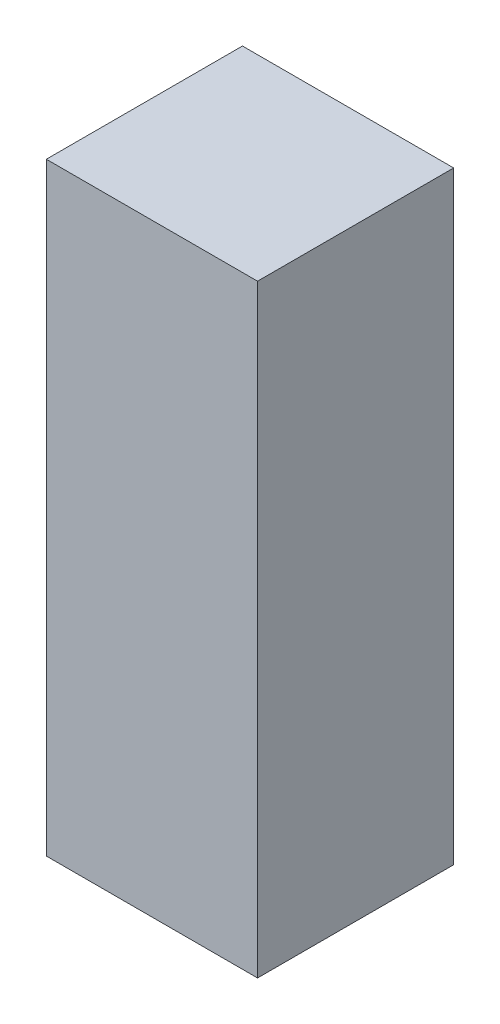
ISO-10303-21;
HEADER;
FILE_DESCRIPTION(('STEP AP214'),'2;1');
FILE_NAME('part.step','',(''),(''),'','','');
FILE_SCHEMA(('AUTOMOTIVE_DESIGN { 1 0 10303 214 1 1 1 1 }'));
ENDSEC;
DATA;
#1=APPLICATION_CONTEXT('core data for automotive mechanical design processes');
#2=APPLICATION_PROTOCOL_DEFINITION('international standard','automotive_design',2000,#1);
#3=PRODUCT_CONTEXT('',#1,'mechanical');
#4=PRODUCT('Part','Part','',(#3));
#5=PRODUCT_RELATED_PRODUCT_CATEGORY('part','',(#4));
#6=PRODUCT_DEFINITION_FORMATION('','',#4);
#7=PRODUCT_DEFINITION_CONTEXT('part definition',#1,'design');
#8=PRODUCT_DEFINITION('design','',#6,#7);
#9=PRODUCT_DEFINITION_SHAPE('','',#8);
#10=(LENGTH_UNIT() NAMED_UNIT(*) SI_UNIT(.MILLI.,.METRE.));
#11=(NAMED_UNIT(*) PLANE_ANGLE_UNIT() SI_UNIT($,.RADIAN.));
#12=(NAMED_UNIT(*) SI_UNIT($,.STERADIAN.) SOLID_ANGLE_UNIT());
#13=UNCERTAINTY_MEASURE_WITH_UNIT(LENGTH_MEASURE(1.E-05),#10,'distance_accuracy_value','');
#14=(GEOMETRIC_REPRESENTATION_CONTEXT(3) GLOBAL_UNCERTAINTY_ASSIGNED_CONTEXT((#13)) GLOBAL_UNIT_ASSIGNED_CONTEXT((#10,
#11,#12)) REPRESENTATION_CONTEXT('',''));
#15=CARTESIAN_POINT('',(0.,0.,0.));
#16=DIRECTION('',(0.,0.,1.));
#17=DIRECTION('',(1.,0.,0.));
#18=AXIS2_PLACEMENT_3D('',#15,#16,#17);
#19=CARTESIAN_POINT('',(24.,1040.,33.));
#20=DIRECTION('',(1.,0.,0.));
#21=DIRECTION('',(0.,0.,-1.));
#22=AXIS2_PLACEMENT_3D('',#19,#20,#21);
#23=PLANE('',#22);
#24=DIRECTION('',(0.,-1.,0.));
#25=VECTOR('',#24,1.);
#26=CARTESIAN_POINT('',(24.,1040.,20.));
#27=LINE('',#26,#25);
#28=CARTESIAN_POINT('',(24.,1080.,20.));
#29=VERTEX_POINT('',#28);
#30=CARTESIAN_POINT('',(24.,1040.,20.));
#31=VERTEX_POINT('',#30);
#32=EDGE_CURVE('E102',#29,#31,#27,.T.);
#33=ORIENTED_EDGE('',*,*,#32,.T.);
#34=DIRECTION('',(0.,0.,-1.));
#35=VECTOR('',#34,1.);
#36=CARTESIAN_POINT('',(24.,1040.,33.));
#37=LINE('',#36,#35);
#38=CARTESIAN_POINT('',(24.,1040.,33.));
#39=VERTEX_POINT('',#38);
#40=EDGE_CURVE('E11',#39,#31,#37,.T.);
#41=ORIENTED_EDGE('',*,*,#40,.F.);
#42=DIRECTION('',(0.,-1.,0.));
#43=VECTOR('',#42,1.);
#44=CARTESIAN_POINT('',(24.,1040.,33.));
#45=LINE('',#44,#43);
#46=CARTESIAN_POINT('',(24.,1080.,33.));
#47=VERTEX_POINT('',#46);
#48=EDGE_CURVE('E90',#47,#39,#45,.T.);
#49=ORIENTED_EDGE('',*,*,#48,.F.);
#50=DIRECTION('',(0.,0.,-1.));
#51=VECTOR('',#50,1.);
#52=CARTESIAN_POINT('',(24.,1080.,33.));
#53=LINE('',#52,#51);
#54=EDGE_CURVE('E98',#47,#29,#53,.T.);
#55=ORIENTED_EDGE('',*,*,#54,.T.);
#56=EDGE_LOOP('',(#33,#41,#49,#55));
#57=FACE_BOUND('',#56,.T.);
#58=ADVANCED_FACE('F39',(#57),#23,.F.);
#59=CARTESIAN_POINT('',(24.,1040.,33.));
#60=DIRECTION('',(0.,1.,0.));
#61=DIRECTION('',(0.,0.,1.));
#62=AXIS2_PLACEMENT_3D('',#59,#60,#61);
#63=PLANE('',#62);
#64=DIRECTION('',(1.,0.,0.));
#65=VECTOR('',#64,1.);
#66=CARTESIAN_POINT('',(24.,1040.,20.));
#67=LINE('',#66,#65);
#68=CARTESIAN_POINT('',(38.,1040.,20.));
#69=VERTEX_POINT('',#68);
#70=EDGE_CURVE('E94',#31,#69,#67,.T.);
#71=ORIENTED_EDGE('',*,*,#70,.T.);
#72=DIRECTION('',(0.,0.,-1.));
#73=VECTOR('',#72,1.);
#74=CARTESIAN_POINT('',(38.,1040.,33.));
#75=LINE('',#74,#73);
#76=CARTESIAN_POINT('',(38.,1040.,33.));
#77=VERTEX_POINT('',#76);
#78=EDGE_CURVE('E47',#77,#69,#75,.T.);
#79=ORIENTED_EDGE('',*,*,#78,.F.);
#80=DIRECTION('',(1.,0.,0.));
#81=VECTOR('',#80,1.);
#82=CARTESIAN_POINT('',(24.,1040.,33.));
#83=LINE('',#82,#81);
#84=EDGE_CURVE('E85',#39,#77,#83,.T.);
#85=ORIENTED_EDGE('',*,*,#84,.F.);
#86=ORIENTED_EDGE('',*,*,#40,.T.);
#87=EDGE_LOOP('',(#71,#79,#85,#86));
#88=FACE_BOUND('',#87,.T.);
#89=ADVANCED_FACE('F93',(#88),#63,.F.);
#90=CARTESIAN_POINT('',(38.,1040.,33.));
#91=DIRECTION('',(-1.,0.,0.));
#92=DIRECTION('',(0.,0.,1.));
#93=AXIS2_PLACEMENT_3D('',#90,#91,#92);
#94=PLANE('',#93);
#95=DIRECTION('',(0.,1.,0.));
#96=VECTOR('',#95,1.);
#97=CARTESIAN_POINT('',(38.,1040.,20.));
#98=LINE('',#97,#96);
#99=CARTESIAN_POINT('',(38.,1080.,20.));
#100=VERTEX_POINT('',#99);
#101=EDGE_CURVE('E72',#69,#100,#98,.T.);
#102=ORIENTED_EDGE('',*,*,#101,.T.);
#103=DIRECTION('',(0.,0.,-1.));
#104=VECTOR('',#103,1.);
#105=CARTESIAN_POINT('',(38.,1080.,33.));
#106=LINE('',#105,#104);
#107=CARTESIAN_POINT('',(38.,1080.,33.));
#108=VERTEX_POINT('',#107);
#109=EDGE_CURVE('E95',#108,#100,#106,.T.);
#110=ORIENTED_EDGE('',*,*,#109,.F.);
#111=DIRECTION('',(0.,1.,0.));
#112=VECTOR('',#111,1.);
#113=CARTESIAN_POINT('',(38.,1040.,33.));
#114=LINE('',#113,#112);
#115=EDGE_CURVE('E88',#77,#108,#114,.T.);
#116=ORIENTED_EDGE('',*,*,#115,.F.);
#117=ORIENTED_EDGE('',*,*,#78,.T.);
#118=EDGE_LOOP('',(#102,#110,#116,#117));
#119=FACE_BOUND('',#118,.T.);
#120=ADVANCED_FACE('F96',(#119),#94,.F.);
#121=CARTESIAN_POINT('',(24.,1080.,33.));
#122=DIRECTION('',(0.,-1.,0.));
#123=DIRECTION('',(0.,0.,-1.));
#124=AXIS2_PLACEMENT_3D('',#121,#122,#123);
#125=PLANE('',#124);
#126=DIRECTION('',(-1.,0.,0.));
#127=VECTOR('',#126,1.);
#128=CARTESIAN_POINT('',(24.,1080.,20.));
#129=LINE('',#128,#127);
#130=EDGE_CURVE('E78',#100,#29,#129,.T.);
#131=ORIENTED_EDGE('',*,*,#130,.T.);
#132=ORIENTED_EDGE('',*,*,#54,.F.);
#133=DIRECTION('',(-1.,0.,0.));
#134=VECTOR('',#133,1.);
#135=CARTESIAN_POINT('',(24.,1080.,33.));
#136=LINE('',#135,#134);
#137=EDGE_CURVE('E55',#108,#47,#136,.T.);
#138=ORIENTED_EDGE('',*,*,#137,.F.);
#139=ORIENTED_EDGE('',*,*,#109,.T.);
#140=EDGE_LOOP('',(#131,#132,#138,#139));
#141=FACE_BOUND('',#140,.T.);
#142=ADVANCED_FACE('F109',(#141),#125,.F.);
#143=CARTESIAN_POINT('',(0.,0.,33.));
#144=DIRECTION('',(0.,0.,-1.));
#145=DIRECTION('',(-1.,0.,0.));
#146=AXIS2_PLACEMENT_3D('',#143,#144,#145);
#147=PLANE('',#146);
#148=ORIENTED_EDGE('',*,*,#48,.T.);
#149=ORIENTED_EDGE('',*,*,#84,.T.);
#150=ORIENTED_EDGE('',*,*,#115,.T.);
#151=ORIENTED_EDGE('',*,*,#137,.T.);
#152=EDGE_LOOP('',(#148,#149,#150,#151));
#153=FACE_BOUND('',#152,.T.);
#154=ADVANCED_FACE('F86',(#153),#147,.F.);
#155=CARTESIAN_POINT('',(0.,0.,20.));
#156=DIRECTION('',(0.,0.,-1.));
#157=DIRECTION('',(-1.,0.,0.));
#158=AXIS2_PLACEMENT_3D('',#155,#156,#157);
#159=PLANE('',#158);
#160=ORIENTED_EDGE('',*,*,#32,.F.);
#161=ORIENTED_EDGE('',*,*,#130,.F.);
#162=ORIENTED_EDGE('',*,*,#101,.F.);
#163=ORIENTED_EDGE('',*,*,#70,.F.);
#164=EDGE_LOOP('',(#160,#161,#162,#163));
#165=FACE_BOUND('',#164,.T.);
#166=ADVANCED_FACE('F112',(#165),#159,.T.);
#167=CLOSED_SHELL('',(#58,#89,#120,#142,#154,#166));
#168=MANIFOLD_SOLID_BREP('B2',#167);
#169=ADVANCED_BREP_SHAPE_REPRESENTATION('',(#18,#168),#14);
#170=SHAPE_DEFINITION_REPRESENTATION(#9,#169);
ENDSEC;
END-ISO-10303-21;
